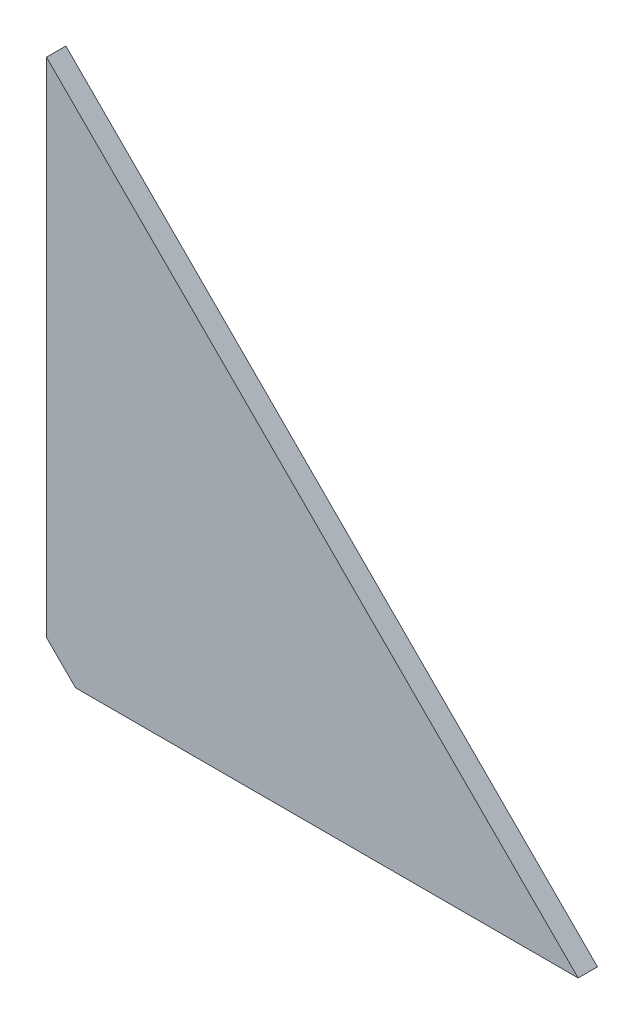
ISO-10303-21;
HEADER;
FILE_DESCRIPTION(('STEP AP214'),'2;1');
FILE_NAME('part.step','',(''),(''),'','','');
FILE_SCHEMA(('AUTOMOTIVE_DESIGN { 1 0 10303 214 1 1 1 1 }'));
ENDSEC;
DATA;
#1=APPLICATION_CONTEXT('core data for automotive mechanical design processes');
#2=APPLICATION_PROTOCOL_DEFINITION('international standard','automotive_design',2000,#1);
#3=PRODUCT_CONTEXT('',#1,'mechanical');
#4=PRODUCT('Part','Part','',(#3));
#5=PRODUCT_RELATED_PRODUCT_CATEGORY('part','',(#4));
#6=PRODUCT_DEFINITION_FORMATION('','',#4);
#7=PRODUCT_DEFINITION_CONTEXT('part definition',#1,'design');
#8=PRODUCT_DEFINITION('design','',#6,#7);
#9=PRODUCT_DEFINITION_SHAPE('','',#8);
#10=(LENGTH_UNIT() NAMED_UNIT(*) SI_UNIT(.MILLI.,.METRE.));
#11=(NAMED_UNIT(*) PLANE_ANGLE_UNIT() SI_UNIT($,.RADIAN.));
#12=(NAMED_UNIT(*) SI_UNIT($,.STERADIAN.) SOLID_ANGLE_UNIT());
#13=UNCERTAINTY_MEASURE_WITH_UNIT(LENGTH_MEASURE(1.E-05),#10,'distance_accuracy_value','');
#14=(GEOMETRIC_REPRESENTATION_CONTEXT(3) GLOBAL_UNCERTAINTY_ASSIGNED_CONTEXT((#13)) GLOBAL_UNIT_ASSIGNED_CONTEXT((#10,
#11,#12)) REPRESENTATION_CONTEXT('',''));
#15=CARTESIAN_POINT('',(0.,0.,0.));
#16=DIRECTION('',(0.,0.,1.));
#17=DIRECTION('',(1.,0.,0.));
#18=AXIS2_PLACEMENT_3D('',#15,#16,#17);
#19=CARTESIAN_POINT('',(110.,0.,-4.));
#20=DIRECTION('',(0.707106781186547,0.707106781186547,0.));
#21=DIRECTION('',(-0.707106781186548,0.707106781186548,0.));
#22=AXIS2_PLACEMENT_3D('',#19,#20,#21);
#23=PLANE('',#22);
#24=DIRECTION('',(-0.707106781186548,0.707106781186548,0.));
#25=VECTOR('',#24,1.);
#26=CARTESIAN_POINT('',(110.,0.,0.));
#27=LINE('',#26,#25);
#28=CARTESIAN_POINT('',(110.,0.,0.));
#29=VERTEX_POINT('',#28);
#30=CARTESIAN_POINT('',(0.,109.999999999999,0.));
#31=VERTEX_POINT('',#30);
#32=EDGE_CURVE('E100',#29,#31,#27,.T.);
#33=ORIENTED_EDGE('',*,*,#32,.F.);
#34=DIRECTION('',(0.,0.,1.));
#35=VECTOR('',#34,1.);
#36=CARTESIAN_POINT('',(110.,0.,-4.));
#37=LINE('',#36,#35);
#38=CARTESIAN_POINT('',(110.,0.,-4.));
#39=VERTEX_POINT('',#38);
#40=EDGE_CURVE('E84',#39,#29,#37,.T.);
#41=ORIENTED_EDGE('',*,*,#40,.F.);
#42=DIRECTION('',(-0.707106781186548,0.707106781186548,0.));
#43=VECTOR('',#42,1.);
#44=CARTESIAN_POINT('',(110.,0.,-4.));
#45=LINE('',#44,#43);
#46=CARTESIAN_POINT('',(0.,109.999999999999,-4.));
#47=VERTEX_POINT('',#46);
#48=EDGE_CURVE('E90',#39,#47,#45,.T.);
#49=ORIENTED_EDGE('',*,*,#48,.T.);
#50=DIRECTION('',(0.,0.,1.));
#51=VECTOR('',#50,1.);
#52=CARTESIAN_POINT('',(0.,109.999999999999,-4.));
#53=LINE('',#52,#51);
#54=EDGE_CURVE('E73',#47,#31,#53,.T.);
#55=ORIENTED_EDGE('',*,*,#54,.T.);
#56=EDGE_LOOP('',(#33,#41,#49,#55));
#57=FACE_BOUND('',#56,.T.);
#58=ADVANCED_FACE('F34',(#57),#23,.T.);
#59=CARTESIAN_POINT('',(0.,0.,-4.));
#60=DIRECTION('',(0.,-1.,0.));
#61=DIRECTION('',(0.,0.,-1.));
#62=AXIS2_PLACEMENT_3D('',#59,#60,#61);
#63=PLANE('',#62);
#64=DIRECTION('',(1.,0.,0.));
#65=VECTOR('',#64,1.);
#66=CARTESIAN_POINT('',(0.,0.,0.));
#67=LINE('',#66,#65);
#68=CARTESIAN_POINT('',(6.00000000000023,0.,0.));
#69=VERTEX_POINT('',#68);
#70=EDGE_CURVE('E95',#69,#29,#67,.T.);
#71=ORIENTED_EDGE('',*,*,#70,.F.);
#72=DIRECTION('',(0.,0.,-1.));
#73=VECTOR('',#72,1.);
#74=CARTESIAN_POINT('',(6.00000000000023,0.,-4.));
#75=LINE('',#74,#73);
#76=CARTESIAN_POINT('',(6.00000000000023,0.,-4.));
#77=VERTEX_POINT('',#76);
#78=EDGE_CURVE('E42',#69,#77,#75,.T.);
#79=ORIENTED_EDGE('',*,*,#78,.T.);
#80=DIRECTION('',(1.,0.,0.));
#81=VECTOR('',#80,1.);
#82=CARTESIAN_POINT('',(0.,0.,-4.));
#83=LINE('',#82,#81);
#84=EDGE_CURVE('E85',#77,#39,#83,.T.);
#85=ORIENTED_EDGE('',*,*,#84,.T.);
#86=ORIENTED_EDGE('',*,*,#40,.T.);
#87=EDGE_LOOP('',(#71,#79,#85,#86));
#88=FACE_BOUND('',#87,.T.);
#89=ADVANCED_FACE('F108',(#88),#63,.T.);
#90=CARTESIAN_POINT('',(0.,109.999999999999,-4.));
#91=DIRECTION('',(-1.,0.,0.));
#92=DIRECTION('',(0.,-1.,0.));
#93=AXIS2_PLACEMENT_3D('',#90,#91,#92);
#94=PLANE('',#93);
#95=DIRECTION('',(0.,-1.,0.));
#96=VECTOR('',#95,1.);
#97=CARTESIAN_POINT('',(0.,109.999999999999,-4.));
#98=LINE('',#97,#96);
#99=CARTESIAN_POINT('',(0.,6.00000000000023,-4.));
#100=VERTEX_POINT('',#99);
#101=EDGE_CURVE('E77',#47,#100,#98,.T.);
#102=ORIENTED_EDGE('',*,*,#101,.T.);
#103=DIRECTION('',(0.,0.,1.));
#104=VECTOR('',#103,1.);
#105=CARTESIAN_POINT('',(0.,6.00000000000023,-4.));
#106=LINE('',#105,#104);
#107=CARTESIAN_POINT('',(0.,6.00000000000023,0.));
#108=VERTEX_POINT('',#107);
#109=EDGE_CURVE('E103',#100,#108,#106,.T.);
#110=ORIENTED_EDGE('',*,*,#109,.T.);
#111=DIRECTION('',(0.,-1.,0.));
#112=VECTOR('',#111,1.);
#113=CARTESIAN_POINT('',(0.,109.999999999999,0.));
#114=LINE('',#113,#112);
#115=EDGE_CURVE('E79',#31,#108,#114,.T.);
#116=ORIENTED_EDGE('',*,*,#115,.F.);
#117=ORIENTED_EDGE('',*,*,#54,.F.);
#118=EDGE_LOOP('',(#102,#110,#116,#117));
#119=FACE_BOUND('',#118,.T.);
#120=ADVANCED_FACE('F75',(#119),#94,.T.);
#121=CARTESIAN_POINT('',(0.,0.,-4.));
#122=DIRECTION('',(0.,0.,1.));
#123=DIRECTION('',(1.,0.,0.));
#124=AXIS2_PLACEMENT_3D('',#121,#122,#123);
#125=PLANE('',#124);
#126=ORIENTED_EDGE('',*,*,#84,.F.);
#127=DIRECTION('',(0.707106781186549,-0.707106781186546,0.));
#128=VECTOR('',#127,1.);
#129=CARTESIAN_POINT('',(0.,6.00000000000023,-4.));
#130=LINE('',#129,#128);
#131=EDGE_CURVE('E11',#77,#100,#130,.F.);
#132=ORIENTED_EDGE('',*,*,#131,.T.);
#133=ORIENTED_EDGE('',*,*,#101,.F.);
#134=ORIENTED_EDGE('',*,*,#48,.F.);
#135=EDGE_LOOP('',(#126,#132,#133,#134));
#136=FACE_BOUND('',#135,.T.);
#137=ADVANCED_FACE('F89',(#136),#125,.F.);
#138=CARTESIAN_POINT('',(0.,0.,0.));
#139=DIRECTION('',(0.,0.,1.));
#140=DIRECTION('',(1.,0.,0.));
#141=AXIS2_PLACEMENT_3D('',#138,#139,#140);
#142=PLANE('',#141);
#143=ORIENTED_EDGE('',*,*,#115,.T.);
#144=DIRECTION('',(-0.707106781186549,0.707106781186546,0.));
#145=VECTOR('',#144,1.);
#146=CARTESIAN_POINT('',(3.00000000000011,3.00000000000011,0.));
#147=LINE('',#146,#145);
#148=EDGE_CURVE('E56',#108,#69,#147,.F.);
#149=ORIENTED_EDGE('',*,*,#148,.T.);
#150=ORIENTED_EDGE('',*,*,#70,.T.);
#151=ORIENTED_EDGE('',*,*,#32,.T.);
#152=EDGE_LOOP('',(#143,#149,#150,#151));
#153=FACE_BOUND('',#152,.T.);
#154=ADVANCED_FACE('F107',(#153),#142,.T.);
#155=CARTESIAN_POINT('',(0.,6.00000000000023,-4.));
#156=DIRECTION('',(0.707106781186546,0.707106781186549,0.));
#157=DIRECTION('',(0.,0.,1.));
#158=AXIS2_PLACEMENT_3D('',#155,#156,#157);
#159=PLANE('',#158);
#160=ORIENTED_EDGE('',*,*,#131,.F.);
#161=ORIENTED_EDGE('',*,*,#78,.F.);
#162=ORIENTED_EDGE('',*,*,#148,.F.);
#163=ORIENTED_EDGE('',*,*,#109,.F.);
#164=EDGE_LOOP('',(#160,#161,#162,#163));
#165=FACE_BOUND('',#164,.T.);
#166=ADVANCED_FACE('F36',(#165),#159,.F.);
#167=CLOSED_SHELL('',(#58,#89,#120,#137,#154,#166));
#168=MANIFOLD_SOLID_BREP('B2',#167);
#169=ADVANCED_BREP_SHAPE_REPRESENTATION('',(#18,#168),#14);
#170=SHAPE_DEFINITION_REPRESENTATION(#9,#169);
ENDSEC;
END-ISO-10303-21;
